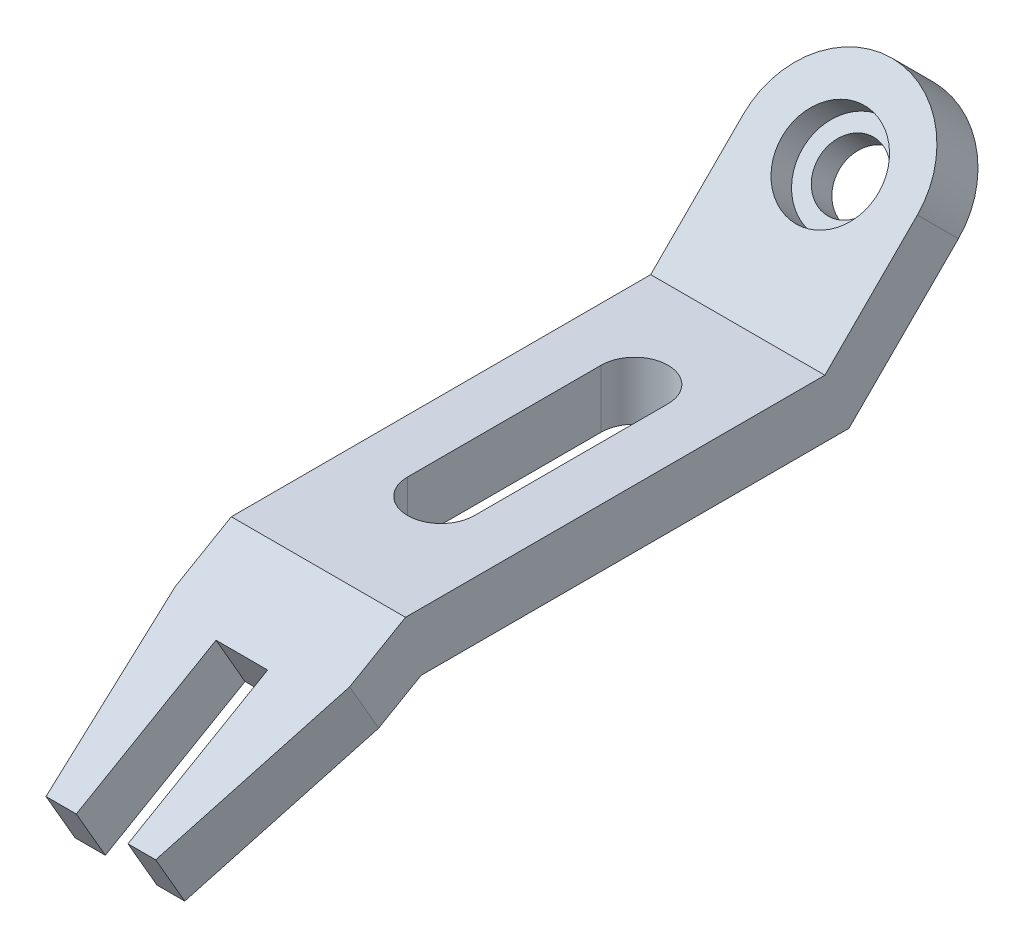
ISO-10303-21;
HEADER;
FILE_DESCRIPTION(('STEP AP214'),'2;1');
FILE_NAME('part.step','',(''),(''),'','','');
FILE_SCHEMA(('AUTOMOTIVE_DESIGN { 1 0 10303 214 1 1 1 1 }'));
ENDSEC;
DATA;
#1=APPLICATION_CONTEXT('core data for automotive mechanical design processes');
#2=APPLICATION_PROTOCOL_DEFINITION('international standard','automotive_design',2000,#1);
#3=PRODUCT_CONTEXT('',#1,'mechanical');
#4=PRODUCT('Part','Part','',(#3));
#5=PRODUCT_RELATED_PRODUCT_CATEGORY('part','',(#4));
#6=PRODUCT_DEFINITION_FORMATION('','',#4);
#7=PRODUCT_DEFINITION_CONTEXT('part definition',#1,'design');
#8=PRODUCT_DEFINITION('design','',#6,#7);
#9=PRODUCT_DEFINITION_SHAPE('','',#8);
#10=(LENGTH_UNIT() NAMED_UNIT(*) SI_UNIT(.MILLI.,.METRE.));
#11=(NAMED_UNIT(*) PLANE_ANGLE_UNIT() SI_UNIT($,.RADIAN.));
#12=(NAMED_UNIT(*) SI_UNIT($,.STERADIAN.) SOLID_ANGLE_UNIT());
#13=UNCERTAINTY_MEASURE_WITH_UNIT(LENGTH_MEASURE(1.E-05),#10,'distance_accuracy_value','');
#14=(GEOMETRIC_REPRESENTATION_CONTEXT(3) GLOBAL_UNCERTAINTY_ASSIGNED_CONTEXT((#13)) GLOBAL_UNIT_ASSIGNED_CONTEXT((#10,
#11,#12)) REPRESENTATION_CONTEXT('',''));
#15=CARTESIAN_POINT('',(0.,0.,0.));
#16=DIRECTION('',(0.,0.,1.));
#17=DIRECTION('',(1.,0.,0.));
#18=AXIS2_PLACEMENT_3D('',#15,#16,#17);
#19=CARTESIAN_POINT('',(-27.,33.9411254969543,-107.462366045532));
#20=DIRECTION('',(0.,0.707106781186546,0.707106781186549));
#21=DIRECTION('',(0.,-0.707106781186549,0.707106781186546));
#22=AXIS2_PLACEMENT_3D('',#19,#20,#21);
#23=CYLINDRICAL_SURFACE('',#22,9.99999999999999);
#24=CARTESIAN_POINT('',(-27.,33.9411254969543,-107.462366045532));
#25=DIRECTION('',(0.,0.707106781186546,0.707106781186549));
#26=DIRECTION('',(0.,-0.707106781186549,0.707106781186546));
#27=AXIS2_PLACEMENT_3D('',#24,#25,#26);
#28=CIRCLE('',#27,9.99999999999999);
#29=CARTESIAN_POINT('',(-27.,26.8700576850889,-100.391298233667));
#30=VERTEX_POINT('',#29);
#31=EDGE_CURVE('E198',#30,#30,#28,.T.);
#32=ORIENTED_EDGE('',*,*,#31,.F.);
#33=EDGE_LOOP('',(#32));
#34=FACE_BOUND('',#33,.T.);
#35=CARTESIAN_POINT('',(-27.,40.3050865276333,-101.098405014853));
#36=DIRECTION('',(0.,0.707106781186546,0.707106781186549));
#37=DIRECTION('',(0.,-0.707106781186549,0.707106781186546));
#38=AXIS2_PLACEMENT_3D('',#35,#36,#37);
#39=CIRCLE('',#38,9.99999999999999);
#40=CARTESIAN_POINT('',(-27.,33.2340187157678,-94.0273372029879));
#41=VERTEX_POINT('',#40);
#42=EDGE_CURVE('E192',#41,#41,#39,.T.);
#43=ORIENTED_EDGE('',*,*,#42,.T.);
#44=EDGE_LOOP('',(#43));
#45=FACE_BOUND('',#44,.T.);
#46=ADVANCED_FACE('F39',(#34,#45),#23,.F.);
#47=CARTESIAN_POINT('',(-54.,-7.58845726811992,72.2551116498264));
#48=DIRECTION('',(0.,-0.866025403784438,-0.500000000000001));
#49=DIRECTION('',(0.,0.500000000000001,-0.866025403784438));
#50=AXIS2_PLACEMENT_3D('',#47,#48,#49);
#51=PLANE('',#50);
#52=DIRECTION('',(0.,0.500000000000001,-0.866025403784438));
#53=VECTOR('',#52,1.);
#54=CARTESIAN_POINT('',(0.,-7.58845726811992,72.2551116498264));
#55=LINE('',#54,#53);
#56=CARTESIAN_POINT('',(0.,-7.58845726811994,72.2551116498264));
#57=VERTEX_POINT('',#56);
#58=CARTESIAN_POINT('',(0.,0.,59.1115181103774));
#59=VERTEX_POINT('',#58);
#60=EDGE_CURVE('E253',#57,#59,#55,.T.);
#61=ORIENTED_EDGE('',*,*,#60,.F.);
#62=DIRECTION('',(-0.203283715128566,-0.489559937894109,0.847942685782857));
#63=VECTOR('',#62,1.);
#64=CARTESIAN_POINT('',(13.2100259312701,24.224713159241,17.1530841197898));
#65=LINE('',#64,#63);
#66=CARTESIAN_POINT('',(-11.6266540274605,-35.58845726812,120.752534261755));
#67=VERTEX_POINT('',#66);
#68=EDGE_CURVE('E217',#57,#67,#65,.T.);
#69=ORIENTED_EDGE('',*,*,#68,.T.);
#70=DIRECTION('',(1.,0.,0.));
#71=VECTOR('',#70,1.);
#72=CARTESIAN_POINT('',(0.,-35.58845726812,120.752534261755));
#73=LINE('',#72,#71);
#74=CARTESIAN_POINT('',(-20.2305864057537,-35.58845726812,120.752534261755));
#75=VERTEX_POINT('',#74);
#76=EDGE_CURVE('E213',#75,#67,#73,.T.);
#77=ORIENTED_EDGE('',*,*,#76,.F.);
#78=DIRECTION('',(0.,-0.500000000000002,0.866025403784438));
#79=VECTOR('',#78,1.);
#80=CARTESIAN_POINT('',(-20.2305864057537,25.5960381699254,14.7778795275945));
#81=LINE('',#80,#79);
#82=CARTESIAN_POINT('',(-20.2305864057537,-10.5884572681199,77.451264072533));
#83=VERTEX_POINT('',#82);
#84=EDGE_CURVE('E210',#83,#75,#81,.T.);
#85=ORIENTED_EDGE('',*,*,#84,.F.);
#86=DIRECTION('',(1.,0.,0.));
#87=VECTOR('',#86,1.);
#88=CARTESIAN_POINT('',(0.,-10.5884572681199,77.451264072533));
#89=LINE('',#88,#87);
#90=CARTESIAN_POINT('',(-36.2305864057537,-10.58845726812,77.451264072533));
#91=VERTEX_POINT('',#90);
#92=EDGE_CURVE('E228',#91,#83,#89,.T.);
#93=ORIENTED_EDGE('',*,*,#92,.F.);
#94=DIRECTION('',(0.,0.500000000000002,-0.866025403784438));
#95=VECTOR('',#94,1.);
#96=CARTESIAN_POINT('',(-36.2305864057537,25.5960381699254,14.7778795275944));
#97=LINE('',#96,#95);
#98=CARTESIAN_POINT('',(-36.2305864057537,-35.58845726812,120.752534261755));
#99=VERTEX_POINT('',#98);
#100=EDGE_CURVE('E225',#99,#91,#97,.T.);
#101=ORIENTED_EDGE('',*,*,#100,.F.);
#102=DIRECTION('',(1.,0.,0.));
#103=VECTOR('',#102,1.);
#104=CARTESIAN_POINT('',(0.,-35.58845726812,120.752534261755));
#105=LINE('',#104,#103);
#106=CARTESIAN_POINT('',(-45.6266540274605,-35.5884572681201,120.752534261755));
#107=VERTEX_POINT('',#106);
#108=EDGE_CURVE('E222',#107,#99,#105,.T.);
#109=ORIENTED_EDGE('',*,*,#108,.F.);
#110=DIRECTION('',(0.147880063568656,-0.49450265085208,0.856503715753292));
#111=VECTOR('',#110,1.);
#112=CARTESIAN_POINT('',(-62.5258417547727,20.9214800874525,22.8744516293693));
#113=LINE('',#112,#111);
#114=CARTESIAN_POINT('',(-54.,-7.58845726811992,72.2551116498264));
#115=VERTEX_POINT('',#114);
#116=EDGE_CURVE('E219',#115,#107,#113,.T.);
#117=ORIENTED_EDGE('',*,*,#116,.F.);
#118=DIRECTION('',(0.,0.500000000000001,-0.866025403784438));
#119=VECTOR('',#118,1.);
#120=CARTESIAN_POINT('',(-54.,-7.58845726811992,72.2551116498264));
#121=LINE('',#120,#119);
#122=CARTESIAN_POINT('',(-54.,0.,59.1115181103774));
#123=VERTEX_POINT('',#122);
#124=EDGE_CURVE('E263',#115,#123,#121,.T.);
#125=ORIENTED_EDGE('',*,*,#124,.T.);
#126=DIRECTION('',(1.,0.,0.));
#127=VECTOR('',#126,1.);
#128=CARTESIAN_POINT('',(-54.,0.,59.1115181103774));
#129=LINE('',#128,#127);
#130=EDGE_CURVE('E287',#123,#59,#129,.T.);
#131=ORIENTED_EDGE('',*,*,#130,.T.);
#132=EDGE_LOOP('',(#61,#69,#77,#85,#93,#101,#109,#117,#125,#131));
#133=FACE_BOUND('',#132,.T.);
#134=ADVANCED_FACE('F41',(#133),#51,.T.);
#135=CARTESIAN_POINT('',(-54.,18.,63.9346035741377));
#136=DIRECTION('',(0.,0.866025403784438,0.500000000000001));
#137=DIRECTION('',(0.,-0.500000000000001,0.866025403784438));
#138=AXIS2_PLACEMENT_3D('',#135,#136,#137);
#139=PLANE('',#138);
#140=DIRECTION('',(0.,-0.500000000000001,0.866025403784438));
#141=VECTOR('',#140,1.);
#142=CARTESIAN_POINT('',(0.,18.,63.9346035741377));
#143=LINE('',#142,#141);
#144=CARTESIAN_POINT('',(0.,18.,63.9346035741377));
#145=VERTEX_POINT('',#144);
#146=CARTESIAN_POINT('',(0.,7.99999999999995,81.2551116498264));
#147=VERTEX_POINT('',#146);
#148=EDGE_CURVE('E305',#145,#147,#143,.T.);
#149=ORIENTED_EDGE('',*,*,#148,.F.);
#150=DIRECTION('',(1.,0.,0.));
#151=VECTOR('',#150,1.);
#152=CARTESIAN_POINT('',(-54.,18.,63.9346035741377));
#153=LINE('',#152,#151);
#154=CARTESIAN_POINT('',(-54.,18.,63.9346035741377));
#155=VERTEX_POINT('',#154);
#156=EDGE_CURVE('E308',#155,#145,#153,.T.);
#157=ORIENTED_EDGE('',*,*,#156,.F.);
#158=DIRECTION('',(0.,-0.500000000000001,0.866025403784438));
#159=VECTOR('',#158,1.);
#160=CARTESIAN_POINT('',(-54.,18.,63.9346035741377));
#161=LINE('',#160,#159);
#162=CARTESIAN_POINT('',(-54.,7.99999999999995,81.2551116498264));
#163=VERTEX_POINT('',#162);
#164=EDGE_CURVE('E282',#155,#163,#161,.T.);
#165=ORIENTED_EDGE('',*,*,#164,.T.);
#166=DIRECTION('',(0.147880063568656,-0.49450265085208,0.856503715753292));
#167=VECTOR('',#166,1.);
#168=CARTESIAN_POINT('',(-62.5258417547727,36.5099373555724,31.8744516293693));
#169=LINE('',#168,#167);
#170=CARTESIAN_POINT('',(-45.6266540274605,-20.0000000000002,129.752534261755));
#171=VERTEX_POINT('',#170);
#172=EDGE_CURVE('E240',#163,#171,#169,.T.);
#173=ORIENTED_EDGE('',*,*,#172,.T.);
#174=DIRECTION('',(1.,0.,0.));
#175=VECTOR('',#174,1.);
#176=CARTESIAN_POINT('',(0.,-20.0000000000001,129.752534261755));
#177=LINE('',#176,#175);
#178=CARTESIAN_POINT('',(-36.2305864057537,-20.0000000000001,129.752534261755));
#179=VERTEX_POINT('',#178);
#180=EDGE_CURVE('E243',#171,#179,#177,.T.);
#181=ORIENTED_EDGE('',*,*,#180,.T.);
#182=DIRECTION('',(0.,0.500000000000002,-0.866025403784438));
#183=VECTOR('',#182,1.);
#184=CARTESIAN_POINT('',(-36.2305864057537,41.1844954380453,23.7778795275945));
#185=LINE('',#184,#183);
#186=CARTESIAN_POINT('',(-36.2305864057537,4.99999999999992,86.4512640725331));
#187=VERTEX_POINT('',#186);
#188=EDGE_CURVE('E246',#179,#187,#185,.T.);
#189=ORIENTED_EDGE('',*,*,#188,.T.);
#190=DIRECTION('',(1.,0.,0.));
#191=VECTOR('',#190,1.);
#192=CARTESIAN_POINT('',(0.,4.99999999999994,86.451264072533));
#193=LINE('',#192,#191);
#194=CARTESIAN_POINT('',(-20.2305864057537,4.99999999999994,86.451264072533));
#195=VERTEX_POINT('',#194);
#196=EDGE_CURVE('E214',#187,#195,#193,.T.);
#197=ORIENTED_EDGE('',*,*,#196,.T.);
#198=DIRECTION('',(0.,-0.500000000000002,0.866025403784438));
#199=VECTOR('',#198,1.);
#200=CARTESIAN_POINT('',(-20.2305864057537,41.1844954380453,23.7778795275945));
#201=LINE('',#200,#199);
#202=CARTESIAN_POINT('',(-20.2305864057537,-20.0000000000002,129.752534261755));
#203=VERTEX_POINT('',#202);
#204=EDGE_CURVE('E207',#195,#203,#201,.T.);
#205=ORIENTED_EDGE('',*,*,#204,.T.);
#206=DIRECTION('',(1.,0.,0.));
#207=VECTOR('',#206,1.);
#208=CARTESIAN_POINT('',(0.,-20.0000000000001,129.752534261755));
#209=LINE('',#208,#207);
#210=CARTESIAN_POINT('',(-11.6266540274605,-20.0000000000001,129.752534261755));
#211=VERTEX_POINT('',#210);
#212=EDGE_CURVE('E234',#203,#211,#209,.T.);
#213=ORIENTED_EDGE('',*,*,#212,.T.);
#214=DIRECTION('',(-0.203283715128566,-0.489559937894109,0.847942685782857));
#215=VECTOR('',#214,1.);
#216=CARTESIAN_POINT('',(13.2100259312701,39.8131704273609,26.1530841197899));
#217=LINE('',#216,#215);
#218=EDGE_CURVE('E237',#147,#211,#217,.T.);
#219=ORIENTED_EDGE('',*,*,#218,.F.);
#220=EDGE_LOOP('',(#149,#157,#165,#173,#181,#189,#197,#205,#213,#219));
#221=FACE_BOUND('',#220,.T.);
#222=ADVANCED_FACE('F344',(#221),#139,.T.);
#223=CARTESIAN_POINT('',(-54.,18.,-66.0653964258623));
#224=DIRECTION('',(0.,1.,0.));
#225=DIRECTION('',(0.,0.,1.));
#226=AXIS2_PLACEMENT_3D('',#223,#224,#225);
#227=PLANE('',#226);
#228=DIRECTION('',(0.,0.,-1.));
#229=VECTOR('',#228,1.);
#230=CARTESIAN_POINT('',(-16.6343205351404,18.,0.));
#231=LINE('',#230,#229);
#232=CARTESIAN_POINT('',(-16.6343205351404,18.,25.9346035741377));
#233=VERTEX_POINT('',#232);
#234=CARTESIAN_POINT('',(-16.6343205351404,18.,-34.0653964258623));
#235=VERTEX_POINT('',#234);
#236=EDGE_CURVE('E54',#233,#235,#231,.T.);
#237=ORIENTED_EDGE('',*,*,#236,.F.);
#238=CARTESIAN_POINT('',(-27.,18.,25.9346035741377));
#239=DIRECTION('',(0.,1.,0.));
#240=DIRECTION('',(0.,0.,1.));
#241=AXIS2_PLACEMENT_3D('',#238,#239,#240);
#242=CIRCLE('',#241,10.3656794648596);
#243=CARTESIAN_POINT('',(-37.3656794648596,18.,25.9346035741377));
#244=VERTEX_POINT('',#243);
#245=EDGE_CURVE('E182',#244,#233,#242,.T.);
#246=ORIENTED_EDGE('',*,*,#245,.F.);
#247=DIRECTION('',(0.,0.,-1.));
#248=VECTOR('',#247,1.);
#249=CARTESIAN_POINT('',(-37.3656794648596,18.,0.));
#250=LINE('',#249,#248);
#251=CARTESIAN_POINT('',(-37.3656794648596,18.,-34.0653964258623));
#252=VERTEX_POINT('',#251);
#253=EDGE_CURVE('E166',#244,#252,#250,.T.);
#254=ORIENTED_EDGE('',*,*,#253,.T.);
#255=CARTESIAN_POINT('',(-27.,18.,-34.0653964258623));
#256=DIRECTION('',(0.,1.,0.));
#257=DIRECTION('',(0.,0.,1.));
#258=AXIS2_PLACEMENT_3D('',#255,#256,#257);
#259=CIRCLE('',#258,10.3656794648596);
#260=EDGE_CURVE('E175',#235,#252,#259,.T.);
#261=ORIENTED_EDGE('',*,*,#260,.F.);
#262=EDGE_LOOP('',(#237,#246,#254,#261));
#263=FACE_BOUND('',#262,.T.);
#264=DIRECTION('',(0.,0.,1.));
#265=VECTOR('',#264,1.);
#266=CARTESIAN_POINT('',(0.,18.,-66.0653964258623));
#267=LINE('',#266,#265);
#268=CARTESIAN_POINT('',(0.,18.,-66.0653964258623));
#269=VERTEX_POINT('',#268);
#270=EDGE_CURVE('E302',#269,#145,#267,.T.);
#271=ORIENTED_EDGE('',*,*,#270,.F.);
#272=DIRECTION('',(1.,0.,0.));
#273=VECTOR('',#272,1.);
#274=CARTESIAN_POINT('',(-54.,18.,-66.0653964258623));
#275=LINE('',#274,#273);
#276=CARTESIAN_POINT('',(-54.,18.,-66.0653964258623));
#277=VERTEX_POINT('',#276);
#278=EDGE_CURVE('E311',#277,#269,#275,.T.);
#279=ORIENTED_EDGE('',*,*,#278,.F.);
#280=DIRECTION('',(0.,0.,1.));
#281=VECTOR('',#280,1.);
#282=CARTESIAN_POINT('',(-54.,18.,-66.0653964258623));
#283=LINE('',#282,#281);
#284=EDGE_CURVE('E279',#277,#155,#283,.T.);
#285=ORIENTED_EDGE('',*,*,#284,.T.);
#286=ORIENTED_EDGE('',*,*,#156,.T.);
#287=EDGE_LOOP('',(#271,#279,#285,#286));
#288=FACE_BOUND('',#287,.T.);
#289=ADVANCED_FACE('F179',(#263,#288),#227,.T.);
#290=CARTESIAN_POINT('',(-54.,46.6690475583122,-94.7344439841744));
#291=DIRECTION('',(0.,0.707106781186546,0.707106781186549));
#292=DIRECTION('',(0.,-0.707106781186549,0.707106781186546));
#293=AXIS2_PLACEMENT_3D('',#290,#291,#292);
#294=PLANE('',#293);
#295=CARTESIAN_POINT('',(-27.,46.6690475583122,-94.7344439841744));
#296=DIRECTION('',(0.,0.707106781186546,0.707106781186549));
#297=DIRECTION('',(0.,-0.707106781186549,0.707106781186546));
#298=AXIS2_PLACEMENT_3D('',#295,#296,#297);
#299=CIRCLE('',#298,15.);
#300=CARTESIAN_POINT('',(-27.,36.062445840514,-84.1278422663762));
#301=VERTEX_POINT('',#300);
#302=EDGE_CURVE('E189',#301,#301,#299,.T.);
#303=ORIENTED_EDGE('',*,*,#302,.F.);
#304=EDGE_LOOP('',(#303));
#305=FACE_BOUND('',#304,.T.);
#306=DIRECTION('',(0.,-0.707106781186549,0.707106781186546));
#307=VECTOR('',#306,1.);
#308=CARTESIAN_POINT('',(0.,46.6690475583122,-94.7344439841744));
#309=LINE('',#308,#307);
#310=CARTESIAN_POINT('',(0.,46.6690475583122,-94.7344439841744));
#311=VERTEX_POINT('',#310);
#312=EDGE_CURVE('E299',#311,#269,#309,.T.);
#313=ORIENTED_EDGE('',*,*,#312,.F.);
#314=CARTESIAN_POINT('',(-27.,46.6690475583122,-94.7344439841744));
#315=DIRECTION('',(0.,0.707106781186546,0.707106781186549));
#316=DIRECTION('',(0.,-0.707106781186549,0.707106781186546));
#317=AXIS2_PLACEMENT_3D('',#314,#315,#316);
#318=CIRCLE('',#317,27.);
#319=CARTESIAN_POINT('',(-54.,46.6690475583122,-94.7344439841744));
#320=VERTEX_POINT('',#319);
#321=EDGE_CURVE('E203',#311,#320,#318,.T.);
#322=ORIENTED_EDGE('',*,*,#321,.T.);
#323=DIRECTION('',(0.,-0.707106781186549,0.707106781186546));
#324=VECTOR('',#323,1.);
#325=CARTESIAN_POINT('',(-54.,46.6690475583122,-94.7344439841744));
#326=LINE('',#325,#324);
#327=EDGE_CURVE('E276',#320,#277,#326,.T.);
#328=ORIENTED_EDGE('',*,*,#327,.T.);
#329=ORIENTED_EDGE('',*,*,#278,.T.);
#330=EDGE_LOOP('',(#313,#322,#328,#329));
#331=FACE_BOUND('',#330,.T.);
#332=ADVANCED_FACE('F395',(#305,#331),#294,.T.);
#333=CARTESIAN_POINT('',(-54.,0.,-73.521240548578));
#334=DIRECTION('',(0.,-0.707106781186546,-0.707106781186549));
#335=DIRECTION('',(0.,0.707106781186549,-0.707106781186546));
#336=AXIS2_PLACEMENT_3D('',#333,#334,#335);
#337=PLANE('',#336);
#338=ORIENTED_EDGE('',*,*,#31,.T.);
#339=EDGE_LOOP('',(#338));
#340=FACE_BOUND('',#339,.T.);
#341=DIRECTION('',(0.,0.707106781186549,-0.707106781186546));
#342=VECTOR('',#341,1.);
#343=CARTESIAN_POINT('',(-54.,0.,-73.521240548578));
#344=LINE('',#343,#342);
#345=CARTESIAN_POINT('',(-54.,0.,-73.521240548578));
#346=VERTEX_POINT('',#345);
#347=CARTESIAN_POINT('',(-54.,33.9411254969544,-107.462366045532));
#348=VERTEX_POINT('',#347);
#349=EDGE_CURVE('E270',#346,#348,#344,.T.);
#350=ORIENTED_EDGE('',*,*,#349,.T.);
#351=CARTESIAN_POINT('',(-27.,33.9411254969543,-107.462366045532));
#352=DIRECTION('',(0.,0.707106781186546,0.707106781186549));
#353=DIRECTION('',(0.,-0.707106781186549,0.707106781186546));
#354=AXIS2_PLACEMENT_3D('',#351,#352,#353);
#355=CIRCLE('',#354,27.);
#356=CARTESIAN_POINT('',(0.,33.9411254969543,-107.462366045532));
#357=VERTEX_POINT('',#356);
#358=EDGE_CURVE('E204',#357,#348,#355,.T.);
#359=ORIENTED_EDGE('',*,*,#358,.F.);
#360=DIRECTION('',(0.,0.707106781186549,-0.707106781186546));
#361=VECTOR('',#360,1.);
#362=CARTESIAN_POINT('',(0.,0.,-73.521240548578));
#363=LINE('',#362,#361);
#364=CARTESIAN_POINT('',(0.,0.,-73.521240548578));
#365=VERTEX_POINT('',#364);
#366=EDGE_CURVE('E293',#365,#357,#363,.T.);
#367=ORIENTED_EDGE('',*,*,#366,.F.);
#368=DIRECTION('',(1.,0.,0.));
#369=VECTOR('',#368,1.);
#370=CARTESIAN_POINT('',(-54.,0.,-73.521240548578));
#371=LINE('',#370,#369);
#372=EDGE_CURVE('E313',#346,#365,#371,.T.);
#373=ORIENTED_EDGE('',*,*,#372,.F.);
#374=EDGE_LOOP('',(#350,#359,#367,#373));
#375=FACE_BOUND('',#374,.T.);
#376=ADVANCED_FACE('F398',(#340,#375),#337,.T.);
#377=CARTESIAN_POINT('',(-54.,0.,59.1115181103774));
#378=DIRECTION('',(0.,-1.,0.));
#379=DIRECTION('',(0.,0.,-1.));
#380=AXIS2_PLACEMENT_3D('',#377,#378,#379);
#381=PLANE('',#380);
#382=DIRECTION('',(0.,0.,1.));
#383=VECTOR('',#382,1.);
#384=CARTESIAN_POINT('',(-16.6343205351404,0.,59.1115181103774));
#385=LINE('',#384,#383);
#386=CARTESIAN_POINT('',(-16.6343205351404,0.,-34.0653964258623));
#387=VERTEX_POINT('',#386);
#388=CARTESIAN_POINT('',(-16.6343205351404,0.,25.9346035741377));
#389=VERTEX_POINT('',#388);
#390=EDGE_CURVE('E11',#387,#389,#385,.T.);
#391=ORIENTED_EDGE('',*,*,#390,.F.);
#392=CARTESIAN_POINT('',(-27.,0.,-34.0653964258623));
#393=DIRECTION('',(0.,-1.,0.));
#394=DIRECTION('',(0.,0.,-1.));
#395=AXIS2_PLACEMENT_3D('',#392,#393,#394);
#396=CIRCLE('',#395,10.3656794648596);
#397=CARTESIAN_POINT('',(-37.3656794648596,0.,-34.0653964258623));
#398=VERTEX_POINT('',#397);
#399=EDGE_CURVE('E310',#398,#387,#396,.T.);
#400=ORIENTED_EDGE('',*,*,#399,.F.);
#401=DIRECTION('',(0.,0.,1.));
#402=VECTOR('',#401,1.);
#403=CARTESIAN_POINT('',(-37.3656794648596,0.,59.1115181103774));
#404=LINE('',#403,#402);
#405=CARTESIAN_POINT('',(-37.3656794648596,0.,25.9346035741377));
#406=VERTEX_POINT('',#405);
#407=EDGE_CURVE('E169',#398,#406,#404,.T.);
#408=ORIENTED_EDGE('',*,*,#407,.T.);
#409=CARTESIAN_POINT('',(-27.,0.,25.9346035741377));
#410=DIRECTION('',(0.,-1.,0.));
#411=DIRECTION('',(0.,0.,-1.));
#412=AXIS2_PLACEMENT_3D('',#409,#410,#411);
#413=CIRCLE('',#412,10.3656794648596);
#414=EDGE_CURVE('E47',#389,#406,#413,.T.);
#415=ORIENTED_EDGE('',*,*,#414,.F.);
#416=EDGE_LOOP('',(#391,#400,#408,#415));
#417=FACE_BOUND('',#416,.T.);
#418=DIRECTION('',(0.,0.,-1.));
#419=VECTOR('',#418,1.);
#420=CARTESIAN_POINT('',(0.,0.,59.1115181103774));
#421=LINE('',#420,#419);
#422=EDGE_CURVE('E290',#59,#365,#421,.T.);
#423=ORIENTED_EDGE('',*,*,#422,.F.);
#424=ORIENTED_EDGE('',*,*,#130,.F.);
#425=DIRECTION('',(0.,0.,-1.));
#426=VECTOR('',#425,1.);
#427=CARTESIAN_POINT('',(-54.,0.,59.1115181103774));
#428=LINE('',#427,#426);
#429=EDGE_CURVE('E266',#123,#346,#428,.T.);
#430=ORIENTED_EDGE('',*,*,#429,.T.);
#431=ORIENTED_EDGE('',*,*,#372,.T.);
#432=EDGE_LOOP('',(#423,#424,#430,#431));
#433=FACE_BOUND('',#432,.T.);
#434=ADVANCED_FACE('F323',(#417,#433),#381,.T.);
#435=CARTESIAN_POINT('',(-54.,0.,0.));
#436=DIRECTION('',(-1.,0.,0.));
#437=DIRECTION('',(0.,0.,1.));
#438=AXIS2_PLACEMENT_3D('',#435,#436,#437);
#439=PLANE('',#438);
#440=ORIENTED_EDGE('',*,*,#124,.F.);
#441=DIRECTION('',(0.,-0.866025403784438,-0.500000000000001));
#442=VECTOR('',#441,1.);
#443=CARTESIAN_POINT('',(-54.,7.99999999999995,81.2551116498264));
#444=LINE('',#443,#442);
#445=EDGE_CURVE('E284',#163,#115,#444,.T.);
#446=ORIENTED_EDGE('',*,*,#445,.F.);
#447=ORIENTED_EDGE('',*,*,#164,.F.);
#448=ORIENTED_EDGE('',*,*,#284,.F.);
#449=ORIENTED_EDGE('',*,*,#327,.F.);
#450=DIRECTION('',(0.,0.707106781186546,0.707106781186549));
#451=VECTOR('',#450,1.);
#452=CARTESIAN_POINT('',(-54.,33.9411254969544,-107.462366045532));
#453=LINE('',#452,#451);
#454=EDGE_CURVE('E273',#348,#320,#453,.T.);
#455=ORIENTED_EDGE('',*,*,#454,.F.);
#456=ORIENTED_EDGE('',*,*,#349,.F.);
#457=ORIENTED_EDGE('',*,*,#429,.F.);
#458=EDGE_LOOP('',(#440,#446,#447,#448,#449,#455,#456,#457));
#459=FACE_BOUND('',#458,.T.);
#460=ADVANCED_FACE('F383',(#459),#439,.T.);
#461=CARTESIAN_POINT('',(0.,0.,0.));
#462=DIRECTION('',(-1.,0.,0.));
#463=DIRECTION('',(0.,0.,1.));
#464=AXIS2_PLACEMENT_3D('',#461,#462,#463);
#465=PLANE('',#464);
#466=ORIENTED_EDGE('',*,*,#60,.T.);
#467=ORIENTED_EDGE('',*,*,#422,.T.);
#468=ORIENTED_EDGE('',*,*,#366,.T.);
#469=DIRECTION('',(0.,0.707106781186546,0.707106781186549));
#470=VECTOR('',#469,1.);
#471=CARTESIAN_POINT('',(0.,33.9411254969544,-107.462366045532));
#472=LINE('',#471,#470);
#473=EDGE_CURVE('E296',#357,#311,#472,.T.);
#474=ORIENTED_EDGE('',*,*,#473,.T.);
#475=ORIENTED_EDGE('',*,*,#312,.T.);
#476=ORIENTED_EDGE('',*,*,#270,.T.);
#477=ORIENTED_EDGE('',*,*,#148,.T.);
#478=DIRECTION('',(0.,-0.866025403784438,-0.500000000000001));
#479=VECTOR('',#478,1.);
#480=CARTESIAN_POINT('',(0.,7.99999999999995,81.2551116498264));
#481=LINE('',#480,#479);
#482=EDGE_CURVE('E267',#147,#57,#481,.T.);
#483=ORIENTED_EDGE('',*,*,#482,.T.);
#484=EDGE_LOOP('',(#466,#467,#468,#474,#475,#476,#477,#483));
#485=FACE_BOUND('',#484,.T.);
#486=ADVANCED_FACE('F381',(#485),#465,.F.);
#487=CARTESIAN_POINT('',(-20.2305864057537,25.5960381699254,14.7778795275945));
#488=DIRECTION('',(-1.,0.,0.));
#489=DIRECTION('',(0.,0.,1.));
#490=AXIS2_PLACEMENT_3D('',#487,#488,#489);
#491=PLANE('',#490);
#492=ORIENTED_EDGE('',*,*,#204,.F.);
#493=DIRECTION('',(0.,0.866025403784438,0.500000000000002));
#494=VECTOR('',#493,1.);
#495=CARTESIAN_POINT('',(-20.2305864057537,-10.5884572681199,77.451264072533));
#496=LINE('',#495,#494);
#497=EDGE_CURVE('E251',#83,#195,#496,.T.);
#498=ORIENTED_EDGE('',*,*,#497,.F.);
#499=ORIENTED_EDGE('',*,*,#84,.T.);
#500=DIRECTION('',(0.,0.866025403784438,0.500000000000002));
#501=VECTOR('',#500,1.);
#502=CARTESIAN_POINT('',(-20.2305864057537,-35.58845726812,120.752534261755));
#503=LINE('',#502,#501);
#504=EDGE_CURVE('E231',#75,#203,#503,.T.);
#505=ORIENTED_EDGE('',*,*,#504,.T.);
#506=EDGE_LOOP('',(#492,#498,#499,#505));
#507=FACE_BOUND('',#506,.T.);
#508=ADVANCED_FACE('F359',(#507),#491,.T.);
#509=CARTESIAN_POINT('',(0.,-10.5884572681199,77.451264072533));
#510=DIRECTION('',(0.,-0.500000000000002,0.866025403784438));
#511=DIRECTION('',(0.,-0.866025403784438,-0.500000000000002));
#512=AXIS2_PLACEMENT_3D('',#509,#510,#511);
#513=PLANE('',#512);
#514=ORIENTED_EDGE('',*,*,#196,.F.);
#515=DIRECTION('',(0.,0.866025403784438,0.500000000000002));
#516=VECTOR('',#515,1.);
#517=CARTESIAN_POINT('',(-36.2305864057537,-10.58845726812,77.451264072533));
#518=LINE('',#517,#516);
#519=EDGE_CURVE('E254',#91,#187,#518,.T.);
#520=ORIENTED_EDGE('',*,*,#519,.F.);
#521=ORIENTED_EDGE('',*,*,#92,.T.);
#522=ORIENTED_EDGE('',*,*,#497,.T.);
#523=EDGE_LOOP('',(#514,#520,#521,#522));
#524=FACE_BOUND('',#523,.T.);
#525=ADVANCED_FACE('F355',(#524),#513,.T.);
#526=CARTESIAN_POINT('',(-36.2305864057537,25.5960381699254,14.7778795275944));
#527=DIRECTION('',(1.,0.,0.));
#528=DIRECTION('',(0.,0.,-1.));
#529=AXIS2_PLACEMENT_3D('',#526,#527,#528);
#530=PLANE('',#529);
#531=ORIENTED_EDGE('',*,*,#188,.F.);
#532=DIRECTION('',(0.,0.866025403784438,0.500000000000002));
#533=VECTOR('',#532,1.);
#534=CARTESIAN_POINT('',(-36.2305864057537,-35.58845726812,120.752534261755));
#535=LINE('',#534,#533);
#536=EDGE_CURVE('E256',#99,#179,#535,.T.);
#537=ORIENTED_EDGE('',*,*,#536,.F.);
#538=ORIENTED_EDGE('',*,*,#100,.T.);
#539=ORIENTED_EDGE('',*,*,#519,.T.);
#540=EDGE_LOOP('',(#531,#537,#538,#539));
#541=FACE_BOUND('',#540,.T.);
#542=ADVANCED_FACE('F358',(#541),#530,.T.);
#543=CARTESIAN_POINT('',(0.,-35.58845726812,120.752534261755));
#544=DIRECTION('',(0.,-0.500000000000002,0.866025403784438));
#545=DIRECTION('',(0.,-0.866025403784438,-0.500000000000002));
#546=AXIS2_PLACEMENT_3D('',#543,#544,#545);
#547=PLANE('',#546);
#548=ORIENTED_EDGE('',*,*,#180,.F.);
#549=DIRECTION('',(0.,0.866025403784438,0.500000000000002));
#550=VECTOR('',#549,1.);
#551=CARTESIAN_POINT('',(-45.6266540274605,-35.5884572681201,120.752534261755));
#552=LINE('',#551,#550);
#553=EDGE_CURVE('E258',#107,#171,#552,.T.);
#554=ORIENTED_EDGE('',*,*,#553,.F.);
#555=ORIENTED_EDGE('',*,*,#108,.T.);
#556=ORIENTED_EDGE('',*,*,#536,.T.);
#557=EDGE_LOOP('',(#548,#554,#555,#556));
#558=FACE_BOUND('',#557,.T.);
#559=ADVANCED_FACE('F363',(#558),#547,.T.);
#560=CARTESIAN_POINT('',(-62.5258417547727,20.9214800874525,22.8744516293693));
#561=DIRECTION('',(-0.989005301704157,-0.0739400317843281,0.128067891763713));
#562=DIRECTION('',(0.128419415589294,0.,0.991719947212772));
#563=AXIS2_PLACEMENT_3D('',#560,#561,#562);
#564=PLANE('',#563);
#565=ORIENTED_EDGE('',*,*,#172,.F.);
#566=ORIENTED_EDGE('',*,*,#445,.T.);
#567=ORIENTED_EDGE('',*,*,#116,.T.);
#568=ORIENTED_EDGE('',*,*,#553,.T.);
#569=EDGE_LOOP('',(#565,#566,#567,#568));
#570=FACE_BOUND('',#569,.T.);
#571=ADVANCED_FACE('F367',(#570),#564,.T.);
#572=CARTESIAN_POINT('',(13.2100259312701,24.224713159241,17.1530841197898));
#573=DIRECTION('',(-0.979119875788214,0.101641857564283,-0.176048861477017));
#574=DIRECTION('',(-0.176965355201142,0.,0.984217081267407));
#575=AXIS2_PLACEMENT_3D('',#572,#573,#574);
#576=PLANE('',#575);
#577=ORIENTED_EDGE('',*,*,#218,.T.);
#578=DIRECTION('',(0.,0.866025403784438,0.500000000000002));
#579=VECTOR('',#578,1.);
#580=CARTESIAN_POINT('',(-11.6266540274605,-35.58845726812,120.752534261755));
#581=LINE('',#580,#579);
#582=EDGE_CURVE('E260',#67,#211,#581,.T.);
#583=ORIENTED_EDGE('',*,*,#582,.F.);
#584=ORIENTED_EDGE('',*,*,#68,.F.);
#585=ORIENTED_EDGE('',*,*,#482,.F.);
#586=EDGE_LOOP('',(#577,#583,#584,#585));
#587=FACE_BOUND('',#586,.T.);
#588=ADVANCED_FACE('F371',(#587),#576,.F.);
#589=CARTESIAN_POINT('',(0.,-35.58845726812,120.752534261755));
#590=DIRECTION('',(0.,-0.500000000000002,0.866025403784438));
#591=DIRECTION('',(0.,-0.866025403784438,-0.500000000000002));
#592=AXIS2_PLACEMENT_3D('',#589,#590,#591);
#593=PLANE('',#592);
#594=ORIENTED_EDGE('',*,*,#212,.F.);
#595=ORIENTED_EDGE('',*,*,#504,.F.);
#596=ORIENTED_EDGE('',*,*,#76,.T.);
#597=ORIENTED_EDGE('',*,*,#582,.T.);
#598=EDGE_LOOP('',(#594,#595,#596,#597));
#599=FACE_BOUND('',#598,.T.);
#600=ADVANCED_FACE('F353',(#599),#593,.T.);
#601=CARTESIAN_POINT('',(-27.,33.9411254969543,-107.462366045532));
#602=DIRECTION('',(0.,0.707106781186546,0.707106781186549));
#603=DIRECTION('',(0.,-0.707106781186549,0.707106781186546));
#604=AXIS2_PLACEMENT_3D('',#601,#602,#603);
#605=CYLINDRICAL_SURFACE('',#604,27.);
#606=ORIENTED_EDGE('',*,*,#358,.T.);
#607=ORIENTED_EDGE('',*,*,#454,.T.);
#608=ORIENTED_EDGE('',*,*,#321,.F.);
#609=ORIENTED_EDGE('',*,*,#473,.F.);
#610=EDGE_LOOP('',(#606,#607,#608,#609));
#611=FACE_BOUND('',#610,.T.);
#612=ADVANCED_FACE('F350',(#611),#605,.T.);
#613=CARTESIAN_POINT('',(-27.,40.3050865276333,-101.098405014853));
#614=DIRECTION('',(0.,0.707106781186546,0.707106781186549));
#615=DIRECTION('',(0.,-0.707106781186549,0.707106781186546));
#616=AXIS2_PLACEMENT_3D('',#613,#614,#615);
#617=CYLINDRICAL_SURFACE('',#616,15.);
#618=CARTESIAN_POINT('',(-27.,40.3050865276333,-101.098405014853));
#619=DIRECTION('',(0.,0.707106781186546,0.707106781186549));
#620=DIRECTION('',(0.,-0.707106781186549,0.707106781186546));
#621=AXIS2_PLACEMENT_3D('',#618,#619,#620);
#622=CIRCLE('',#621,15.);
#623=CARTESIAN_POINT('',(-27.,29.698484809835,-90.4918032970552));
#624=VERTEX_POINT('',#623);
#625=EDGE_CURVE('E195',#624,#624,#622,.T.);
#626=ORIENTED_EDGE('',*,*,#625,.F.);
#627=EDGE_LOOP('',(#626));
#628=FACE_BOUND('',#627,.T.);
#629=ORIENTED_EDGE('',*,*,#302,.T.);
#630=EDGE_LOOP('',(#629));
#631=FACE_BOUND('',#630,.T.);
#632=ADVANCED_FACE('F334',(#628,#631),#617,.F.);
#633=CARTESIAN_POINT('',(0.,-30.3966592436101,-30.3966592436102));
#634=DIRECTION('',(0.,0.707106781186546,0.707106781186549));
#635=DIRECTION('',(0.,-0.707106781186549,0.707106781186546));
#636=AXIS2_PLACEMENT_3D('',#633,#634,#635);
#637=PLANE('',#636);
#638=ORIENTED_EDGE('',*,*,#42,.F.);
#639=EDGE_LOOP('',(#638));
#640=FACE_BOUND('',#639,.T.);
#641=ORIENTED_EDGE('',*,*,#625,.T.);
#642=EDGE_LOOP('',(#641));
#643=FACE_BOUND('',#642,.T.);
#644=ADVANCED_FACE('F327',(#640,#643),#637,.T.);
#645=CARTESIAN_POINT('',(-16.6343205351404,-35.5884572681201,0.));
#646=DIRECTION('',(1.,0.,0.));
#647=DIRECTION('',(0.,0.,-1.));
#648=AXIS2_PLACEMENT_3D('',#645,#646,#647);
#649=PLANE('',#648);
#650=ORIENTED_EDGE('',*,*,#390,.T.);
#651=DIRECTION('',(0.,1.,0.));
#652=VECTOR('',#651,1.);
#653=CARTESIAN_POINT('',(-16.6343205351404,-35.5884572681201,25.9346035741377));
#654=LINE('',#653,#652);
#655=EDGE_CURVE('E187',#389,#233,#654,.T.);
#656=ORIENTED_EDGE('',*,*,#655,.T.);
#657=ORIENTED_EDGE('',*,*,#236,.T.);
#658=DIRECTION('',(0.,1.,0.));
#659=VECTOR('',#658,1.);
#660=CARTESIAN_POINT('',(-16.6343205351404,-35.5884572681201,-34.0653964258623));
#661=LINE('',#660,#659);
#662=EDGE_CURVE('E172',#387,#235,#661,.T.);
#663=ORIENTED_EDGE('',*,*,#662,.F.);
#664=EDGE_LOOP('',(#650,#656,#657,#663));
#665=FACE_BOUND('',#664,.T.);
#666=ADVANCED_FACE('F325',(#665),#649,.F.);
#667=CARTESIAN_POINT('',(-27.,-35.5884572681201,25.9346035741377));
#668=DIRECTION('',(0.,1.,0.));
#669=DIRECTION('',(0.,0.,1.));
#670=AXIS2_PLACEMENT_3D('',#667,#668,#669);
#671=CYLINDRICAL_SURFACE('',#670,10.3656794648596);
#672=ORIENTED_EDGE('',*,*,#414,.T.);
#673=DIRECTION('',(0.,1.,0.));
#674=VECTOR('',#673,1.);
#675=CARTESIAN_POINT('',(-37.3656794648596,-35.5884572681201,25.9346035741377));
#676=LINE('',#675,#674);
#677=EDGE_CURVE('E171',#406,#244,#676,.T.);
#678=ORIENTED_EDGE('',*,*,#677,.T.);
#679=ORIENTED_EDGE('',*,*,#245,.T.);
#680=ORIENTED_EDGE('',*,*,#655,.F.);
#681=EDGE_LOOP('',(#672,#678,#679,#680));
#682=FACE_BOUND('',#681,.T.);
#683=ADVANCED_FACE('F320',(#682),#671,.F.);
#684=CARTESIAN_POINT('',(-37.3656794648596,-35.5884572681201,0.));
#685=DIRECTION('',(1.,0.,0.));
#686=DIRECTION('',(0.,0.,-1.));
#687=AXIS2_PLACEMENT_3D('',#684,#685,#686);
#688=PLANE('',#687);
#689=DIRECTION('',(0.,1.,0.));
#690=VECTOR('',#689,1.);
#691=CARTESIAN_POINT('',(-37.3656794648596,-35.5884572681201,-34.0653964258623));
#692=LINE('',#691,#690);
#693=EDGE_CURVE('E62',#398,#252,#692,.T.);
#694=ORIENTED_EDGE('',*,*,#693,.T.);
#695=ORIENTED_EDGE('',*,*,#253,.F.);
#696=ORIENTED_EDGE('',*,*,#677,.F.);
#697=ORIENTED_EDGE('',*,*,#407,.F.);
#698=EDGE_LOOP('',(#694,#695,#696,#697));
#699=FACE_BOUND('',#698,.T.);
#700=ADVANCED_FACE('F163',(#699),#688,.T.);
#701=CARTESIAN_POINT('',(-27.,-35.5884572681201,-34.0653964258623));
#702=DIRECTION('',(0.,1.,0.));
#703=DIRECTION('',(0.,0.,1.));
#704=AXIS2_PLACEMENT_3D('',#701,#702,#703);
#705=CYLINDRICAL_SURFACE('',#704,10.3656794648596);
#706=ORIENTED_EDGE('',*,*,#399,.T.);
#707=ORIENTED_EDGE('',*,*,#662,.T.);
#708=ORIENTED_EDGE('',*,*,#260,.T.);
#709=ORIENTED_EDGE('',*,*,#693,.F.);
#710=EDGE_LOOP('',(#706,#707,#708,#709));
#711=FACE_BOUND('',#710,.T.);
#712=ADVANCED_FACE('F176',(#711),#705,.F.);
#713=CLOSED_SHELL('',(#46,#134,#222,#289,#332,#376,#434,#460,#486,#508,#525,#542,#559,#571,#588,
#600,#612,#632,#644,#666,#683,#700,#712));
#714=MANIFOLD_SOLID_BREP('B2',#713);
#715=ADVANCED_BREP_SHAPE_REPRESENTATION('',(#18,#714),#14);
#716=SHAPE_DEFINITION_REPRESENTATION(#9,#715);
ENDSEC;
END-ISO-10303-21;
